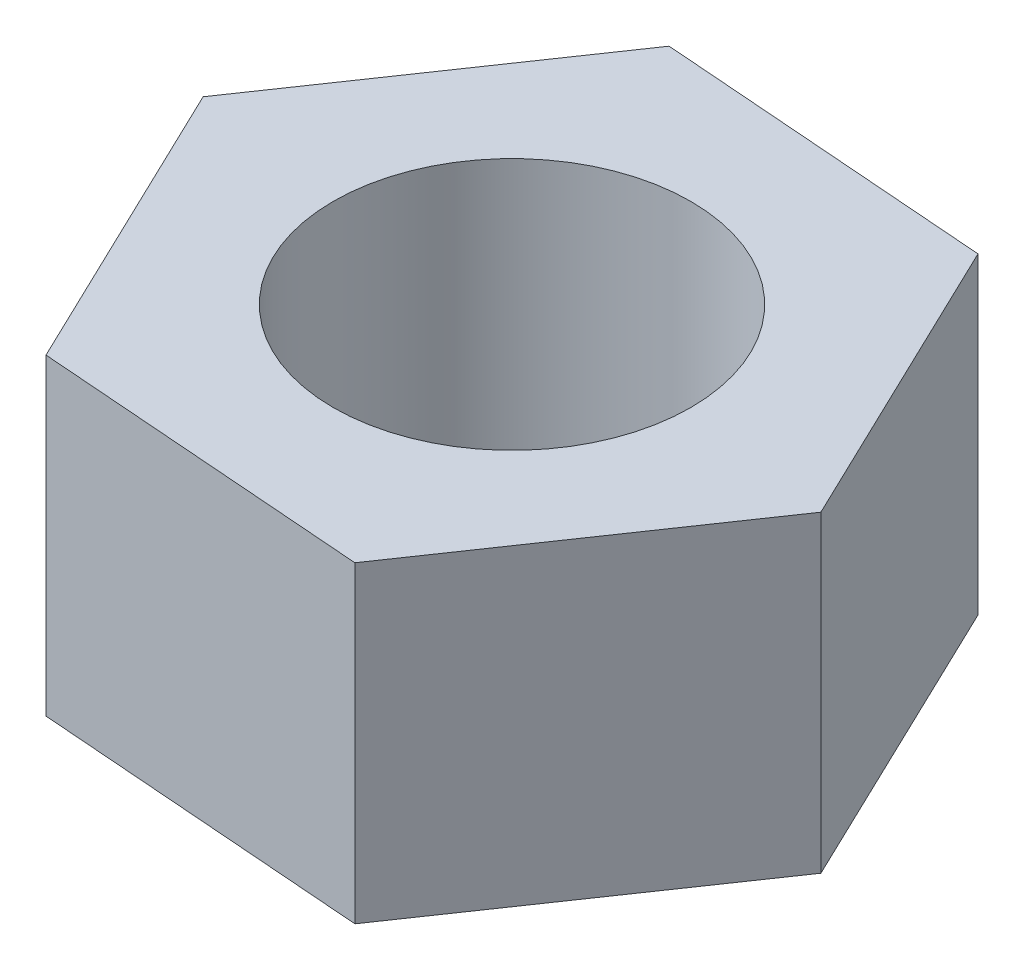
ISO-10303-21;
HEADER;
FILE_DESCRIPTION(('STEP AP214'),'2;1');
FILE_NAME('part.step','',(''),(''),'','','');
FILE_SCHEMA(('AUTOMOTIVE_DESIGN { 1 0 10303 214 1 1 1 1 }'));
ENDSEC;
DATA;
#1=APPLICATION_CONTEXT('core data for automotive mechanical design processes');
#2=APPLICATION_PROTOCOL_DEFINITION('international standard','automotive_design',2000,#1);
#3=PRODUCT_CONTEXT('',#1,'mechanical');
#4=PRODUCT('Part','Part','',(#3));
#5=PRODUCT_RELATED_PRODUCT_CATEGORY('part','',(#4));
#6=PRODUCT_DEFINITION_FORMATION('','',#4);
#7=PRODUCT_DEFINITION_CONTEXT('part definition',#1,'design');
#8=PRODUCT_DEFINITION('design','',#6,#7);
#9=PRODUCT_DEFINITION_SHAPE('','',#8);
#10=(LENGTH_UNIT() NAMED_UNIT(*) SI_UNIT(.MILLI.,.METRE.));
#11=(NAMED_UNIT(*) PLANE_ANGLE_UNIT() SI_UNIT($,.RADIAN.));
#12=(NAMED_UNIT(*) SI_UNIT($,.STERADIAN.) SOLID_ANGLE_UNIT());
#13=UNCERTAINTY_MEASURE_WITH_UNIT(LENGTH_MEASURE(1.E-05),#10,'distance_accuracy_value','');
#14=(GEOMETRIC_REPRESENTATION_CONTEXT(3) GLOBAL_UNCERTAINTY_ASSIGNED_CONTEXT((#13)) GLOBAL_UNIT_ASSIGNED_CONTEXT((#10,
#11,#12)) REPRESENTATION_CONTEXT('',''));
#15=CARTESIAN_POINT('',(0.,0.,0.));
#16=DIRECTION('',(0.,0.,1.));
#17=DIRECTION('',(1.,0.,0.));
#18=AXIS2_PLACEMENT_3D('',#15,#16,#17);
#19=CARTESIAN_POINT('',(3.2488778227583,7.,6.76595346023919));
#20=DIRECTION('',(0.,1.,0.));
#21=DIRECTION('',(0.,0.,1.));
#22=AXIS2_PLACEMENT_3D('',#19,#20,#21);
#23=PLANE('',#22);
#24=DIRECTION('',(0.997118532204565,0.,0.0758592956348394));
#25=VECTOR('',#24,1.);
#26=CARTESIAN_POINT('',(-4.23504866601121,7.,6.19658745842016));
#27=LINE('',#26,#25);
#28=CARTESIAN_POINT('',(-4.23504866601121,7.,6.19658745842016));
#29=VERTEX_POINT('',#28);
#30=CARTESIAN_POINT('',(3.2488778227583,7.,6.76595346023919));
#31=VERTEX_POINT('',#30);
#32=EDGE_CURVE('E128',#29,#31,#27,.T.);
#33=ORIENTED_EDGE('',*,*,#32,.T.);
#34=DIRECTION('',(0.564255343235247,0.,-0.825600331655986));
#35=VECTOR('',#34,1.);
#36=CARTESIAN_POINT('',(3.2488778227583,7.,6.76595346023919));
#37=LINE('',#36,#35);
#38=CARTESIAN_POINT('',(7.48392648876951,7.,0.569366001819025));
#39=VERTEX_POINT('',#38);
#40=EDGE_CURVE('E86',#31,#39,#37,.T.);
#41=ORIENTED_EDGE('',*,*,#40,.T.);
#42=DIRECTION('',(-0.432863188969318,0.,-0.901459627290825));
#43=VECTOR('',#42,1.);
#44=CARTESIAN_POINT('',(7.48392648876951,7.,0.569366001819025));
#45=LINE('',#44,#43);
#46=CARTESIAN_POINT('',(4.23504866601121,7.,-6.19658745842016));
#47=VERTEX_POINT('',#46);
#48=EDGE_CURVE('E99',#39,#47,#45,.T.);
#49=ORIENTED_EDGE('',*,*,#48,.T.);
#50=DIRECTION('',(-0.997118532204565,0.,-0.0758592956348392));
#51=VECTOR('',#50,1.);
#52=CARTESIAN_POINT('',(4.23504866601121,7.,-6.19658745842016));
#53=LINE('',#52,#51);
#54=CARTESIAN_POINT('',(-3.2488778227583,7.,-6.76595346023919));
#55=VERTEX_POINT('',#54);
#56=EDGE_CURVE('E93',#47,#55,#53,.T.);
#57=ORIENTED_EDGE('',*,*,#56,.T.);
#58=DIRECTION('',(-0.564255343235247,0.,0.825600331655986));
#59=VECTOR('',#58,1.);
#60=CARTESIAN_POINT('',(-3.2488778227583,7.,-6.76595346023919));
#61=LINE('',#60,#59);
#62=CARTESIAN_POINT('',(-7.48392648876951,7.,-0.569366001819026));
#63=VERTEX_POINT('',#62);
#64=EDGE_CURVE('E97',#55,#63,#61,.T.);
#65=ORIENTED_EDGE('',*,*,#64,.T.);
#66=DIRECTION('',(0.432863188969318,0.,0.901459627290825));
#67=VECTOR('',#66,1.);
#68=CARTESIAN_POINT('',(-7.48392648876951,7.,-0.569366001819026));
#69=LINE('',#68,#67);
#70=EDGE_CURVE('E49',#63,#29,#69,.T.);
#71=ORIENTED_EDGE('',*,*,#70,.T.);
#72=EDGE_LOOP('',(#33,#41,#49,#57,#65,#71));
#73=FACE_BOUND('',#72,.T.);
#74=CARTESIAN_POINT('',(0.,7.,0.));
#75=DIRECTION('',(0.,1.,0.));
#76=DIRECTION('',(0.,0.,1.));
#77=AXIS2_PLACEMENT_3D('',#74,#75,#76);
#78=CIRCLE('',#77,4.);
#79=CARTESIAN_POINT('',(0.,7.,4.));
#80=VERTEX_POINT('',#79);
#81=EDGE_CURVE('E121',#80,#80,#78,.T.);
#82=ORIENTED_EDGE('',*,*,#81,.F.);
#83=EDGE_LOOP('',(#82));
#84=FACE_BOUND('',#83,.T.);
#85=ADVANCED_FACE('F32',(#73,#84),#23,.T.);
#86=CARTESIAN_POINT('',(3.2488778227583,0.,6.76595346023919));
#87=DIRECTION('',(0.,1.,0.));
#88=DIRECTION('',(0.,0.,1.));
#89=AXIS2_PLACEMENT_3D('',#86,#87,#88);
#90=PLANE('',#89);
#91=DIRECTION('',(0.997118532204565,0.,0.0758592956348394));
#92=VECTOR('',#91,1.);
#93=CARTESIAN_POINT('',(-4.23504866601121,0.,6.19658745842016));
#94=LINE('',#93,#92);
#95=CARTESIAN_POINT('',(-4.23504866601121,0.,6.19658745842016));
#96=VERTEX_POINT('',#95);
#97=CARTESIAN_POINT('',(3.2488778227583,0.,6.76595346023919));
#98=VERTEX_POINT('',#97);
#99=EDGE_CURVE('E117',#96,#98,#94,.T.);
#100=ORIENTED_EDGE('',*,*,#99,.F.);
#101=DIRECTION('',(0.432863188969318,0.,0.901459627290825));
#102=VECTOR('',#101,1.);
#103=CARTESIAN_POINT('',(-7.48392648876951,0.,-0.569366001819026));
#104=LINE('',#103,#102);
#105=CARTESIAN_POINT('',(-7.48392648876951,0.,-0.569366001819026));
#106=VERTEX_POINT('',#105);
#107=EDGE_CURVE('E78',#106,#96,#104,.T.);
#108=ORIENTED_EDGE('',*,*,#107,.F.);
#109=DIRECTION('',(-0.564255343235247,0.,0.825600331655986));
#110=VECTOR('',#109,1.);
#111=CARTESIAN_POINT('',(-3.2488778227583,0.,-6.76595346023919));
#112=LINE('',#111,#110);
#113=CARTESIAN_POINT('',(-3.2488778227583,0.,-6.76595346023919));
#114=VERTEX_POINT('',#113);
#115=EDGE_CURVE('E72',#114,#106,#112,.T.);
#116=ORIENTED_EDGE('',*,*,#115,.F.);
#117=DIRECTION('',(-0.997118532204565,0.,-0.0758592956348392));
#118=VECTOR('',#117,1.);
#119=CARTESIAN_POINT('',(4.23504866601121,0.,-6.19658745842016));
#120=LINE('',#119,#118);
#121=CARTESIAN_POINT('',(4.23504866601121,0.,-6.19658745842016));
#122=VERTEX_POINT('',#121);
#123=EDGE_CURVE('E107',#122,#114,#120,.T.);
#124=ORIENTED_EDGE('',*,*,#123,.F.);
#125=DIRECTION('',(-0.432863188969318,0.,-0.901459627290825));
#126=VECTOR('',#125,1.);
#127=CARTESIAN_POINT('',(7.48392648876951,0.,0.569366001819025));
#128=LINE('',#127,#126);
#129=CARTESIAN_POINT('',(7.48392648876951,0.,0.569366001819025));
#130=VERTEX_POINT('',#129);
#131=EDGE_CURVE('E123',#130,#122,#128,.T.);
#132=ORIENTED_EDGE('',*,*,#131,.F.);
#133=DIRECTION('',(0.564255343235247,0.,-0.825600331655986));
#134=VECTOR('',#133,1.);
#135=CARTESIAN_POINT('',(3.2488778227583,0.,6.76595346023919));
#136=LINE('',#135,#134);
#137=EDGE_CURVE('E120',#98,#130,#136,.T.);
#138=ORIENTED_EDGE('',*,*,#137,.F.);
#139=EDGE_LOOP('',(#100,#108,#116,#124,#132,#138));
#140=FACE_BOUND('',#139,.T.);
#141=CARTESIAN_POINT('',(0.,0.,0.));
#142=DIRECTION('',(0.,1.,0.));
#143=DIRECTION('',(0.,0.,1.));
#144=AXIS2_PLACEMENT_3D('',#141,#142,#143);
#145=CIRCLE('',#144,4.);
#146=CARTESIAN_POINT('',(0.,0.,4.));
#147=VERTEX_POINT('',#146);
#148=EDGE_CURVE('E221',#147,#147,#145,.T.);
#149=ORIENTED_EDGE('',*,*,#148,.T.);
#150=EDGE_LOOP('',(#149));
#151=FACE_BOUND('',#150,.T.);
#152=ADVANCED_FACE('F137',(#140,#151),#90,.F.);
#153=CARTESIAN_POINT('',(-4.23504866601121,7.,6.19658745842016));
#154=DIRECTION('',(0.0758592956348394,0.,-0.997118532204565));
#155=DIRECTION('',(-0.997118532204565,0.,-0.0758592956348394));
#156=AXIS2_PLACEMENT_3D('',#153,#154,#155);
#157=PLANE('',#156);
#158=ORIENTED_EDGE('',*,*,#99,.T.);
#159=DIRECTION('',(0.,-1.,0.));
#160=VECTOR('',#159,1.);
#161=CARTESIAN_POINT('',(3.2488778227583,7.,6.76595346023919));
#162=LINE('',#161,#160);
#163=EDGE_CURVE('E11',#31,#98,#162,.T.);
#164=ORIENTED_EDGE('',*,*,#163,.F.);
#165=ORIENTED_EDGE('',*,*,#32,.F.);
#166=DIRECTION('',(0.,-1.,0.));
#167=VECTOR('',#166,1.);
#168=CARTESIAN_POINT('',(-4.23504866601121,7.,6.19658745842016));
#169=LINE('',#168,#167);
#170=EDGE_CURVE('E113',#29,#96,#169,.T.);
#171=ORIENTED_EDGE('',*,*,#170,.T.);
#172=EDGE_LOOP('',(#158,#164,#165,#171));
#173=FACE_BOUND('',#172,.T.);
#174=ADVANCED_FACE('F34',(#173),#157,.F.);
#175=CARTESIAN_POINT('',(3.2488778227583,7.,6.76595346023919));
#176=DIRECTION('',(-0.825600331655986,0.,-0.564255343235247));
#177=DIRECTION('',(-0.564255343235247,0.,0.825600331655986));
#178=AXIS2_PLACEMENT_3D('',#175,#176,#177);
#179=PLANE('',#178);
#180=ORIENTED_EDGE('',*,*,#137,.T.);
#181=DIRECTION('',(0.,-1.,0.));
#182=VECTOR('',#181,1.);
#183=CARTESIAN_POINT('',(7.48392648876951,7.,0.569366001819025));
#184=LINE('',#183,#182);
#185=EDGE_CURVE('E41',#39,#130,#184,.T.);
#186=ORIENTED_EDGE('',*,*,#185,.F.);
#187=ORIENTED_EDGE('',*,*,#40,.F.);
#188=ORIENTED_EDGE('',*,*,#163,.T.);
#189=EDGE_LOOP('',(#180,#186,#187,#188));
#190=FACE_BOUND('',#189,.T.);
#191=ADVANCED_FACE('F162',(#190),#179,.F.);
#192=CARTESIAN_POINT('',(7.48392648876951,7.,0.569366001819025));
#193=DIRECTION('',(-0.901459627290825,0.,0.432863188969318));
#194=DIRECTION('',(0.432863188969318,0.,0.901459627290825));
#195=AXIS2_PLACEMENT_3D('',#192,#193,#194);
#196=PLANE('',#195);
#197=ORIENTED_EDGE('',*,*,#131,.T.);
#198=DIRECTION('',(0.,-1.,0.));
#199=VECTOR('',#198,1.);
#200=CARTESIAN_POINT('',(4.23504866601121,7.,-6.19658745842016));
#201=LINE('',#200,#199);
#202=EDGE_CURVE('E108',#47,#122,#201,.T.);
#203=ORIENTED_EDGE('',*,*,#202,.F.);
#204=ORIENTED_EDGE('',*,*,#48,.F.);
#205=ORIENTED_EDGE('',*,*,#185,.T.);
#206=EDGE_LOOP('',(#197,#203,#204,#205));
#207=FACE_BOUND('',#206,.T.);
#208=ADVANCED_FACE('F134',(#207),#196,.F.);
#209=CARTESIAN_POINT('',(4.23504866601121,7.,-6.19658745842016));
#210=DIRECTION('',(-0.0758592956348392,0.,0.997118532204565));
#211=DIRECTION('',(0.997118532204565,0.,0.0758592956348392));
#212=AXIS2_PLACEMENT_3D('',#209,#210,#211);
#213=PLANE('',#212);
#214=ORIENTED_EDGE('',*,*,#123,.T.);
#215=DIRECTION('',(0.,-1.,0.));
#216=VECTOR('',#215,1.);
#217=CARTESIAN_POINT('',(-3.2488778227583,7.,-6.76595346023919));
#218=LINE('',#217,#216);
#219=EDGE_CURVE('E104',#55,#114,#218,.T.);
#220=ORIENTED_EDGE('',*,*,#219,.F.);
#221=ORIENTED_EDGE('',*,*,#56,.F.);
#222=ORIENTED_EDGE('',*,*,#202,.T.);
#223=EDGE_LOOP('',(#214,#220,#221,#222));
#224=FACE_BOUND('',#223,.T.);
#225=ADVANCED_FACE('F105',(#224),#213,.F.);
#226=CARTESIAN_POINT('',(-3.2488778227583,7.,-6.76595346023919));
#227=DIRECTION('',(0.825600331655986,0.,0.564255343235247));
#228=DIRECTION('',(0.564255343235247,0.,-0.825600331655986));
#229=AXIS2_PLACEMENT_3D('',#226,#227,#228);
#230=PLANE('',#229);
#231=ORIENTED_EDGE('',*,*,#115,.T.);
#232=DIRECTION('',(0.,-1.,0.));
#233=VECTOR('',#232,1.);
#234=CARTESIAN_POINT('',(-7.48392648876951,7.,-0.569366001819026));
#235=LINE('',#234,#233);
#236=EDGE_CURVE('E109',#63,#106,#235,.T.);
#237=ORIENTED_EDGE('',*,*,#236,.F.);
#238=ORIENTED_EDGE('',*,*,#64,.F.);
#239=ORIENTED_EDGE('',*,*,#219,.T.);
#240=EDGE_LOOP('',(#231,#237,#238,#239));
#241=FACE_BOUND('',#240,.T.);
#242=ADVANCED_FACE('F111',(#241),#230,.F.);
#243=CARTESIAN_POINT('',(-7.48392648876951,7.,-0.569366001819026));
#244=DIRECTION('',(0.901459627290825,0.,-0.432863188969318));
#245=DIRECTION('',(-0.432863188969318,0.,-0.901459627290825));
#246=AXIS2_PLACEMENT_3D('',#243,#244,#245);
#247=PLANE('',#246);
#248=ORIENTED_EDGE('',*,*,#107,.T.);
#249=ORIENTED_EDGE('',*,*,#170,.F.);
#250=ORIENTED_EDGE('',*,*,#70,.F.);
#251=ORIENTED_EDGE('',*,*,#236,.T.);
#252=EDGE_LOOP('',(#248,#249,#250,#251));
#253=FACE_BOUND('',#252,.T.);
#254=ADVANCED_FACE('F142',(#253),#247,.F.);
#255=CARTESIAN_POINT('',(0.,7.,0.));
#256=DIRECTION('',(0.,-1.,0.));
#257=DIRECTION('',(0.,0.,-1.));
#258=AXIS2_PLACEMENT_3D('',#255,#256,#257);
#259=CYLINDRICAL_SURFACE('',#258,4.);
#260=ORIENTED_EDGE('',*,*,#81,.T.);
#261=EDGE_LOOP('',(#260));
#262=FACE_BOUND('',#261,.T.);
#263=ORIENTED_EDGE('',*,*,#148,.F.);
#264=EDGE_LOOP('',(#263));
#265=FACE_BOUND('',#264,.T.);
#266=ADVANCED_FACE('F144',(#262,#265),#259,.F.);
#267=CLOSED_SHELL('',(#85,#152,#174,#191,#208,#225,#242,#254,#266));
#268=MANIFOLD_SOLID_BREP('B2',#267);
#269=ADVANCED_BREP_SHAPE_REPRESENTATION('',(#18,#268),#14);
#270=SHAPE_DEFINITION_REPRESENTATION(#9,#269);
ENDSEC;
END-ISO-10303-21;
